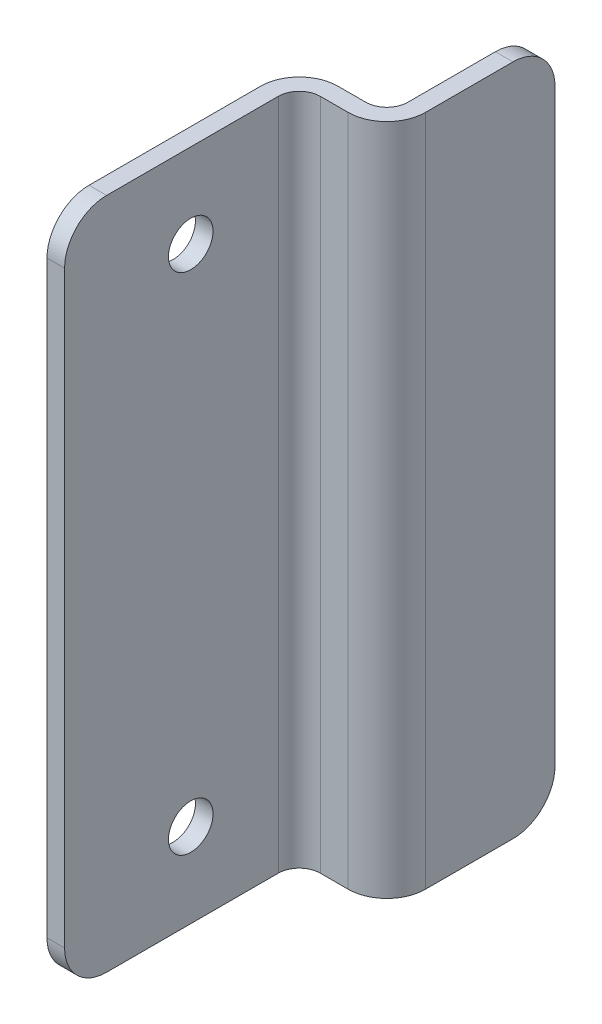
ISO-10303-21;
HEADER;
FILE_DESCRIPTION(('STEP AP214'),'2;1');
FILE_NAME('part.step','',(''),(''),'','','');
FILE_SCHEMA(('AUTOMOTIVE_DESIGN { 1 0 10303 214 1 1 1 1 }'));
ENDSEC;
DATA;
#1=APPLICATION_CONTEXT('core data for automotive mechanical design processes');
#2=APPLICATION_PROTOCOL_DEFINITION('international standard','automotive_design',2000,#1);
#3=PRODUCT_CONTEXT('',#1,'mechanical');
#4=PRODUCT('Part','Part','',(#3));
#5=PRODUCT_RELATED_PRODUCT_CATEGORY('part','',(#4));
#6=PRODUCT_DEFINITION_FORMATION('','',#4);
#7=PRODUCT_DEFINITION_CONTEXT('part definition',#1,'design');
#8=PRODUCT_DEFINITION('design','',#6,#7);
#9=PRODUCT_DEFINITION_SHAPE('','',#8);
#10=(LENGTH_UNIT() NAMED_UNIT(*) SI_UNIT(.MILLI.,.METRE.));
#11=(NAMED_UNIT(*) PLANE_ANGLE_UNIT() SI_UNIT($,.RADIAN.));
#12=(NAMED_UNIT(*) SI_UNIT($,.STERADIAN.) SOLID_ANGLE_UNIT());
#13=UNCERTAINTY_MEASURE_WITH_UNIT(LENGTH_MEASURE(1.E-05),#10,'distance_accuracy_value','');
#14=(GEOMETRIC_REPRESENTATION_CONTEXT(3) GLOBAL_UNCERTAINTY_ASSIGNED_CONTEXT((#13)) GLOBAL_UNIT_ASSIGNED_CONTEXT((#10,
#11,#12)) REPRESENTATION_CONTEXT('',''));
#15=CARTESIAN_POINT('',(0.,0.,0.));
#16=DIRECTION('',(0.,0.,1.));
#17=DIRECTION('',(1.,0.,0.));
#18=AXIS2_PLACEMENT_3D('',#15,#16,#17);
#19=CARTESIAN_POINT('',(22.225,0.,-6.04266));
#20=DIRECTION('',(0.,0.,-1.));
#21=DIRECTION('',(-1.,0.,0.));
#22=AXIS2_PLACEMENT_3D('',#19,#20,#21);
#23=PLANE('',#22);
#24=DIRECTION('',(0.,1.,0.));
#25=VECTOR('',#24,1.);
#26=CARTESIAN_POINT('',(22.225,0.,-6.04266));
#27=LINE('',#26,#25);
#28=CARTESIAN_POINT('',(22.225,6.35,-6.04266));
#29=VERTEX_POINT('',#28);
#30=CARTESIAN_POINT('',(22.225,95.25,-6.04266));
#31=VERTEX_POINT('',#30);
#32=EDGE_CURVE('E228',#29,#31,#27,.T.);
#33=ORIENTED_EDGE('',*,*,#32,.F.);
#34=DIRECTION('',(1.,0.,0.));
#35=VECTOR('',#34,1.);
#36=CARTESIAN_POINT('',(-14.34465,6.35,-6.04266));
#37=LINE('',#36,#35);
#38=CARTESIAN_POINT('',(19.56816,6.35,-6.04266));
#39=VERTEX_POINT('',#38);
#40=EDGE_CURVE('E132',#39,#29,#37,.T.);
#41=ORIENTED_EDGE('',*,*,#40,.F.);
#42=DIRECTION('',(0.,1.,0.));
#43=VECTOR('',#42,1.);
#44=CARTESIAN_POINT('',(19.56816,0.,-6.04266));
#45=LINE('',#44,#43);
#46=CARTESIAN_POINT('',(19.56816,95.25,-6.04266));
#47=VERTEX_POINT('',#46);
#48=EDGE_CURVE('E216',#47,#39,#45,.F.);
#49=ORIENTED_EDGE('',*,*,#48,.F.);
#50=DIRECTION('',(-1.,0.,0.));
#51=VECTOR('',#50,1.);
#52=CARTESIAN_POINT('',(42.91965,95.25,-6.04266));
#53=LINE('',#52,#51);
#54=EDGE_CURVE('E159',#31,#47,#53,.T.);
#55=ORIENTED_EDGE('',*,*,#54,.F.);
#56=EDGE_LOOP('',(#33,#41,#49,#55));
#57=FACE_BOUND('',#56,.T.);
#58=ADVANCED_FACE('F16',(#57),#23,.T.);
#59=CARTESIAN_POINT('',(-14.34465,6.35,0.30734));
#60=DIRECTION('',(1.,0.,0.));
#61=DIRECTION('',(0.,0.,-1.));
#62=AXIS2_PLACEMENT_3D('',#59,#60,#61);
#63=CYLINDRICAL_SURFACE('',#62,6.35);
#64=ORIENTED_EDGE('',*,*,#40,.T.);
#65=CARTESIAN_POINT('',(22.225,6.35,0.30734));
#66=DIRECTION('',(1.,0.,0.));
#67=DIRECTION('',(0.,0.,-1.));
#68=AXIS2_PLACEMENT_3D('',#65,#66,#67);
#69=CIRCLE('',#68,6.35);
#70=CARTESIAN_POINT('',(22.225,0.,0.30734));
#71=VERTEX_POINT('',#70);
#72=EDGE_CURVE('E19',#71,#29,#69,.T.);
#73=ORIENTED_EDGE('',*,*,#72,.F.);
#74=DIRECTION('',(1.,0.,0.));
#75=VECTOR('',#74,1.);
#76=CARTESIAN_POINT('',(0.,0.,0.30734));
#77=LINE('',#76,#75);
#78=CARTESIAN_POINT('',(19.56816,0.,0.30734));
#79=VERTEX_POINT('',#78);
#80=EDGE_CURVE('E130',#71,#79,#77,.F.);
#81=ORIENTED_EDGE('',*,*,#80,.T.);
#82=CARTESIAN_POINT('',(19.56816,6.35,0.30734));
#83=DIRECTION('',(1.,0.,0.));
#84=DIRECTION('',(0.,0.,-1.));
#85=AXIS2_PLACEMENT_3D('',#82,#83,#84);
#86=CIRCLE('',#85,6.35);
#87=EDGE_CURVE('E213',#39,#79,#86,.F.);
#88=ORIENTED_EDGE('',*,*,#87,.F.);
#89=EDGE_LOOP('',(#64,#73,#81,#88));
#90=FACE_BOUND('',#89,.T.);
#91=ADVANCED_FACE('F127',(#90),#63,.T.);
#92=CARTESIAN_POINT('',(9.00684,0.,19.35734));
#93=DIRECTION('',(0.,0.,1.));
#94=DIRECTION('',(1.,0.,0.));
#95=AXIS2_PLACEMENT_3D('',#92,#93,#94);
#96=PLANE('',#95);
#97=DIRECTION('',(1.,0.,0.));
#98=VECTOR('',#97,1.);
#99=CARTESIAN_POINT('',(0.,0.,19.35734));
#100=LINE('',#99,#98);
#101=CARTESIAN_POINT('',(12.18184,0.,19.35734));
#102=VERTEX_POINT('',#101);
#103=CARTESIAN_POINT('',(16.383,0.,19.35734));
#104=VERTEX_POINT('',#103);
#105=EDGE_CURVE('E208',#102,#104,#100,.T.);
#106=ORIENTED_EDGE('',*,*,#105,.T.);
#107=DIRECTION('',(0.,-1.,0.));
#108=VECTOR('',#107,1.);
#109=CARTESIAN_POINT('',(16.383,234.04576,19.35734));
#110=LINE('',#109,#108);
#111=CARTESIAN_POINT('',(16.383,101.6,19.35734));
#112=VERTEX_POINT('',#111);
#113=EDGE_CURVE('E158',#112,#104,#110,.T.);
#114=ORIENTED_EDGE('',*,*,#113,.F.);
#115=DIRECTION('',(1.,0.,0.));
#116=VECTOR('',#115,1.);
#117=CARTESIAN_POINT('',(0.,101.6,19.35734));
#118=LINE('',#117,#116);
#119=CARTESIAN_POINT('',(12.18184,101.6,19.35734));
#120=VERTEX_POINT('',#119);
#121=EDGE_CURVE('E196',#120,#112,#118,.T.);
#122=ORIENTED_EDGE('',*,*,#121,.F.);
#123=DIRECTION('',(0.,1.,0.));
#124=VECTOR('',#123,1.);
#125=CARTESIAN_POINT('',(12.18184,-132.44576,19.35734));
#126=LINE('',#125,#124);
#127=EDGE_CURVE('E155',#120,#102,#126,.F.);
#128=ORIENTED_EDGE('',*,*,#127,.T.);
#129=EDGE_LOOP('',(#106,#114,#122,#128));
#130=FACE_BOUND('',#129,.T.);
#131=ADVANCED_FACE('F463',(#130),#96,.T.);
#132=CARTESIAN_POINT('',(16.383,234.04576,13.51534));
#133=DIRECTION('',(0.,-1.,0.));
#134=DIRECTION('',(0.,0.,-1.));
#135=AXIS2_PLACEMENT_3D('',#132,#133,#134);
#136=CYLINDRICAL_SURFACE('',#135,5.842);
#137=ORIENTED_EDGE('',*,*,#113,.T.);
#138=CARTESIAN_POINT('',(16.383,0.,13.51534));
#139=DIRECTION('',(0.,-1.,0.));
#140=DIRECTION('',(0.,0.,-1.));
#141=AXIS2_PLACEMENT_3D('',#138,#139,#140);
#142=CIRCLE('',#141,5.842);
#143=CARTESIAN_POINT('',(22.225,0.,13.51534));
#144=VERTEX_POINT('',#143);
#145=EDGE_CURVE('E143',#104,#144,#142,.F.);
#146=ORIENTED_EDGE('',*,*,#145,.T.);
#147=DIRECTION('',(0.,1.,0.));
#148=VECTOR('',#147,1.);
#149=CARTESIAN_POINT('',(22.225,0.,13.51534));
#150=LINE('',#149,#148);
#151=CARTESIAN_POINT('',(22.225,101.6,13.51534));
#152=VERTEX_POINT('',#151);
#153=EDGE_CURVE('E135',#152,#144,#150,.F.);
#154=ORIENTED_EDGE('',*,*,#153,.F.);
#155=CARTESIAN_POINT('',(16.383,101.6,13.51534));
#156=DIRECTION('',(0.,-1.,0.));
#157=DIRECTION('',(0.,0.,-1.));
#158=AXIS2_PLACEMENT_3D('',#155,#156,#157);
#159=CIRCLE('',#158,5.842);
#160=EDGE_CURVE('E192',#112,#152,#159,.F.);
#161=ORIENTED_EDGE('',*,*,#160,.F.);
#162=EDGE_LOOP('',(#137,#146,#154,#161));
#163=FACE_BOUND('',#162,.T.);
#164=ADVANCED_FACE('F248',(#163),#136,.T.);
#165=CARTESIAN_POINT('',(22.225,0.,19.35734));
#166=DIRECTION('',(1.,0.,0.));
#167=DIRECTION('',(0.,0.,-1.));
#168=AXIS2_PLACEMENT_3D('',#165,#166,#167);
#169=PLANE('',#168);
#170=DIRECTION('',(0.,0.,1.));
#171=VECTOR('',#170,1.);
#172=CARTESIAN_POINT('',(22.225,0.,0.));
#173=LINE('',#172,#171);
#174=EDGE_CURVE('E138',#144,#71,#173,.F.);
#175=ORIENTED_EDGE('',*,*,#174,.T.);
#176=ORIENTED_EDGE('',*,*,#72,.T.);
#177=ORIENTED_EDGE('',*,*,#32,.T.);
#178=CARTESIAN_POINT('',(22.225,95.25,0.30734));
#179=DIRECTION('',(-1.,0.,0.));
#180=DIRECTION('',(0.,0.,1.));
#181=AXIS2_PLACEMENT_3D('',#178,#179,#180);
#182=CIRCLE('',#181,6.35);
#183=CARTESIAN_POINT('',(22.225,101.6,0.30734));
#184=VERTEX_POINT('',#183);
#185=EDGE_CURVE('E134',#184,#31,#182,.T.);
#186=ORIENTED_EDGE('',*,*,#185,.F.);
#187=DIRECTION('',(0.,0.,1.));
#188=VECTOR('',#187,1.);
#189=CARTESIAN_POINT('',(22.225,101.6,0.));
#190=LINE('',#189,#188);
#191=EDGE_CURVE('E195',#152,#184,#190,.F.);
#192=ORIENTED_EDGE('',*,*,#191,.F.);
#193=ORIENTED_EDGE('',*,*,#153,.T.);
#194=EDGE_LOOP('',(#175,#176,#177,#186,#192,#193));
#195=FACE_BOUND('',#194,.T.);
#196=ADVANCED_FACE('F139',(#195),#169,.T.);
#197=CARTESIAN_POINT('',(42.91965,95.25,0.30734));
#198=DIRECTION('',(-1.,0.,0.));
#199=DIRECTION('',(0.,0.,1.));
#200=AXIS2_PLACEMENT_3D('',#197,#198,#199);
#201=CYLINDRICAL_SURFACE('',#200,6.35);
#202=ORIENTED_EDGE('',*,*,#54,.T.);
#203=CARTESIAN_POINT('',(19.56816,95.25,0.30734));
#204=DIRECTION('',(-1.,0.,0.));
#205=DIRECTION('',(0.,0.,1.));
#206=AXIS2_PLACEMENT_3D('',#203,#204,#205);
#207=CIRCLE('',#206,6.35);
#208=CARTESIAN_POINT('',(19.56816,101.6,0.30734));
#209=VERTEX_POINT('',#208);
#210=EDGE_CURVE('E160',#209,#47,#207,.T.);
#211=ORIENTED_EDGE('',*,*,#210,.F.);
#212=DIRECTION('',(1.,0.,0.));
#213=VECTOR('',#212,1.);
#214=CARTESIAN_POINT('',(0.,101.6,0.30734));
#215=LINE('',#214,#213);
#216=EDGE_CURVE('E225',#184,#209,#215,.F.);
#217=ORIENTED_EDGE('',*,*,#216,.F.);
#218=ORIENTED_EDGE('',*,*,#185,.T.);
#219=EDGE_LOOP('',(#202,#211,#217,#218));
#220=FACE_BOUND('',#219,.T.);
#221=ADVANCED_FACE('F221',(#220),#201,.T.);
#222=CARTESIAN_POINT('',(19.56816,0.,-6.04266));
#223=DIRECTION('',(-1.,0.,0.));
#224=DIRECTION('',(0.,0.,1.));
#225=AXIS2_PLACEMENT_3D('',#222,#223,#224);
#226=PLANE('',#225);
#227=ORIENTED_EDGE('',*,*,#48,.T.);
#228=ORIENTED_EDGE('',*,*,#87,.T.);
#229=DIRECTION('',(0.,0.,1.));
#230=VECTOR('',#229,1.);
#231=CARTESIAN_POINT('',(19.56816,0.,0.));
#232=LINE('',#231,#230);
#233=CARTESIAN_POINT('',(19.56816,0.,13.5255));
#234=VERTEX_POINT('',#233);
#235=EDGE_CURVE('E149',#79,#234,#232,.T.);
#236=ORIENTED_EDGE('',*,*,#235,.T.);
#237=DIRECTION('',(0.,1.,0.));
#238=VECTOR('',#237,1.);
#239=CARTESIAN_POINT('',(19.56816,-132.44576,13.5255));
#240=LINE('',#239,#238);
#241=CARTESIAN_POINT('',(19.56816,101.6,13.5255));
#242=VERTEX_POINT('',#241);
#243=EDGE_CURVE('E215',#234,#242,#240,.T.);
#244=ORIENTED_EDGE('',*,*,#243,.T.);
#245=DIRECTION('',(0.,0.,1.));
#246=VECTOR('',#245,1.);
#247=CARTESIAN_POINT('',(19.56816,101.6,0.));
#248=LINE('',#247,#246);
#249=EDGE_CURVE('E191',#209,#242,#248,.T.);
#250=ORIENTED_EDGE('',*,*,#249,.F.);
#251=ORIENTED_EDGE('',*,*,#210,.T.);
#252=EDGE_LOOP('',(#227,#228,#236,#244,#250,#251));
#253=FACE_BOUND('',#252,.T.);
#254=ADVANCED_FACE('F235',(#253),#226,.T.);
#255=CARTESIAN_POINT('',(16.39316,-132.44576,13.5255));
#256=DIRECTION('',(0.,1.,0.));
#257=DIRECTION('',(0.,0.,1.));
#258=AXIS2_PLACEMENT_3D('',#255,#256,#257);
#259=CYLINDRICAL_SURFACE('',#258,3.175);
#260=ORIENTED_EDGE('',*,*,#243,.F.);
#261=CARTESIAN_POINT('',(16.39316,0.,13.5255));
#262=DIRECTION('',(0.,1.,0.));
#263=DIRECTION('',(0.,0.,1.));
#264=AXIS2_PLACEMENT_3D('',#261,#262,#263);
#265=CIRCLE('',#264,3.175);
#266=CARTESIAN_POINT('',(16.39316,0.,16.7005));
#267=VERTEX_POINT('',#266);
#268=EDGE_CURVE('E151',#234,#267,#265,.F.);
#269=ORIENTED_EDGE('',*,*,#268,.T.);
#270=DIRECTION('',(0.,1.,0.));
#271=VECTOR('',#270,1.);
#272=CARTESIAN_POINT('',(16.39316,0.,16.7005));
#273=LINE('',#272,#271);
#274=CARTESIAN_POINT('',(16.39316,101.6,16.7005));
#275=VERTEX_POINT('',#274);
#276=EDGE_CURVE('E294',#275,#267,#273,.F.);
#277=ORIENTED_EDGE('',*,*,#276,.F.);
#278=CARTESIAN_POINT('',(16.39316,101.6,13.5255));
#279=DIRECTION('',(0.,1.,0.));
#280=DIRECTION('',(0.,0.,1.));
#281=AXIS2_PLACEMENT_3D('',#278,#279,#280);
#282=CIRCLE('',#281,3.175);
#283=EDGE_CURVE('E188',#242,#275,#282,.F.);
#284=ORIENTED_EDGE('',*,*,#283,.F.);
#285=EDGE_LOOP('',(#260,#269,#277,#284));
#286=FACE_BOUND('',#285,.T.);
#287=ADVANCED_FACE('F310',(#286),#259,.F.);
#288=CARTESIAN_POINT('',(19.56816,0.,16.7005));
#289=DIRECTION('',(0.,0.,-1.));
#290=DIRECTION('',(-1.,0.,0.));
#291=AXIS2_PLACEMENT_3D('',#288,#289,#290);
#292=PLANE('',#291);
#293=DIRECTION('',(1.,0.,0.));
#294=VECTOR('',#293,1.);
#295=CARTESIAN_POINT('',(0.,0.,16.7005));
#296=LINE('',#295,#294);
#297=CARTESIAN_POINT('',(12.192,0.,16.7005));
#298=VERTEX_POINT('',#297);
#299=EDGE_CURVE('E205',#267,#298,#296,.F.);
#300=ORIENTED_EDGE('',*,*,#299,.T.);
#301=DIRECTION('',(0.,-1.,0.));
#302=VECTOR('',#301,1.);
#303=CARTESIAN_POINT('',(12.192,234.04576,16.7005));
#304=LINE('',#303,#302);
#305=CARTESIAN_POINT('',(12.192,101.6,16.7005));
#306=VERTEX_POINT('',#305);
#307=EDGE_CURVE('E291',#306,#298,#304,.T.);
#308=ORIENTED_EDGE('',*,*,#307,.F.);
#309=DIRECTION('',(1.,0.,0.));
#310=VECTOR('',#309,1.);
#311=CARTESIAN_POINT('',(0.,101.6,16.7005));
#312=LINE('',#311,#310);
#313=EDGE_CURVE('E187',#275,#306,#312,.F.);
#314=ORIENTED_EDGE('',*,*,#313,.F.);
#315=ORIENTED_EDGE('',*,*,#276,.T.);
#316=EDGE_LOOP('',(#300,#308,#314,#315));
#317=FACE_BOUND('',#316,.T.);
#318=ADVANCED_FACE('F299',(#317),#292,.T.);
#319=CARTESIAN_POINT('',(12.192,234.04576,22.5425));
#320=DIRECTION('',(0.,-1.,0.));
#321=DIRECTION('',(0.,0.,-1.));
#322=AXIS2_PLACEMENT_3D('',#319,#320,#321);
#323=CYLINDRICAL_SURFACE('',#322,5.842);
#324=ORIENTED_EDGE('',*,*,#307,.T.);
#325=CARTESIAN_POINT('',(12.192,0.,22.5425));
#326=DIRECTION('',(0.,-1.,0.));
#327=DIRECTION('',(0.,0.,-1.));
#328=AXIS2_PLACEMENT_3D('',#325,#326,#327);
#329=CIRCLE('',#328,5.842);
#330=CARTESIAN_POINT('',(6.35,0.,22.5425));
#331=VERTEX_POINT('',#330);
#332=EDGE_CURVE('E202',#298,#331,#329,.F.);
#333=ORIENTED_EDGE('',*,*,#332,.T.);
#334=DIRECTION('',(0.,1.,0.));
#335=VECTOR('',#334,1.);
#336=CARTESIAN_POINT('',(6.35,0.,22.5425));
#337=LINE('',#336,#335);
#338=CARTESIAN_POINT('',(6.35,101.6,22.5425));
#339=VERTEX_POINT('',#338);
#340=EDGE_CURVE('E288',#339,#331,#337,.F.);
#341=ORIENTED_EDGE('',*,*,#340,.F.);
#342=CARTESIAN_POINT('',(12.192,101.6,22.5425));
#343=DIRECTION('',(0.,-1.,0.));
#344=DIRECTION('',(0.,0.,-1.));
#345=AXIS2_PLACEMENT_3D('',#342,#343,#344);
#346=CIRCLE('',#345,5.842);
#347=EDGE_CURVE('E183',#306,#339,#346,.F.);
#348=ORIENTED_EDGE('',*,*,#347,.F.);
#349=EDGE_LOOP('',(#324,#333,#341,#348));
#350=FACE_BOUND('',#349,.T.);
#351=ADVANCED_FACE('F303',(#350),#323,.T.);
#352=CARTESIAN_POINT('',(6.35,0.,16.7005));
#353=DIRECTION('',(-1.,0.,0.));
#354=DIRECTION('',(0.,0.,1.));
#355=AXIS2_PLACEMENT_3D('',#352,#353,#354);
#356=PLANE('',#355);
#357=CARTESIAN_POINT('',(6.35,88.9,35.7505));
#358=DIRECTION('',(1.,0.,0.));
#359=DIRECTION('',(0.,0.,-1.));
#360=AXIS2_PLACEMENT_3D('',#357,#358,#359);
#361=CIRCLE('',#360,3.3655);
#362=CARTESIAN_POINT('',(6.35,88.9,32.385));
#363=VERTEX_POINT('',#362);
#364=EDGE_CURVE('E173',#363,#363,#361,.T.);
#365=ORIENTED_EDGE('',*,*,#364,.T.);
#366=EDGE_LOOP('',(#365));
#367=FACE_BOUND('',#366,.T.);
#368=CARTESIAN_POINT('',(6.35,12.7,35.7505));
#369=DIRECTION('',(1.,0.,0.));
#370=DIRECTION('',(0.,0.,-1.));
#371=AXIS2_PLACEMENT_3D('',#368,#369,#370);
#372=CIRCLE('',#371,3.3655);
#373=CARTESIAN_POINT('',(6.35,12.7,32.385));
#374=VERTEX_POINT('',#373);
#375=EDGE_CURVE('E176',#374,#374,#372,.T.);
#376=ORIENTED_EDGE('',*,*,#375,.T.);
#377=EDGE_LOOP('',(#376));
#378=FACE_BOUND('',#377,.T.);
#379=DIRECTION('',(0.,1.,0.));
#380=VECTOR('',#379,1.);
#381=CARTESIAN_POINT('',(6.35,0.,54.8005));
#382=LINE('',#381,#380);
#383=CARTESIAN_POINT('',(6.35,95.25,54.8005));
#384=VERTEX_POINT('',#383);
#385=CARTESIAN_POINT('',(6.35,6.35,54.8005));
#386=VERTEX_POINT('',#385);
#387=EDGE_CURVE('E286',#384,#386,#382,.F.);
#388=ORIENTED_EDGE('',*,*,#387,.F.);
#389=CARTESIAN_POINT('',(6.35,95.25,48.4505));
#390=DIRECTION('',(1.,0.,0.));
#391=DIRECTION('',(0.,0.,-1.));
#392=AXIS2_PLACEMENT_3D('',#389,#390,#391);
#393=CIRCLE('',#392,6.35);
#394=CARTESIAN_POINT('',(6.35,101.6,48.4505));
#395=VERTEX_POINT('',#394);
#396=EDGE_CURVE('E180',#395,#384,#393,.T.);
#397=ORIENTED_EDGE('',*,*,#396,.F.);
#398=DIRECTION('',(0.,0.,1.));
#399=VECTOR('',#398,1.);
#400=CARTESIAN_POINT('',(6.35,101.6,0.));
#401=LINE('',#400,#399);
#402=EDGE_CURVE('E186',#339,#395,#401,.T.);
#403=ORIENTED_EDGE('',*,*,#402,.F.);
#404=ORIENTED_EDGE('',*,*,#340,.T.);
#405=DIRECTION('',(0.,0.,1.));
#406=VECTOR('',#405,1.);
#407=CARTESIAN_POINT('',(6.35,0.,0.));
#408=LINE('',#407,#406);
#409=CARTESIAN_POINT('',(6.35,0.,48.4505));
#410=VERTEX_POINT('',#409);
#411=EDGE_CURVE('E204',#331,#410,#408,.T.);
#412=ORIENTED_EDGE('',*,*,#411,.T.);
#413=CARTESIAN_POINT('',(6.35,6.35,48.4505));
#414=DIRECTION('',(-1.,0.,0.));
#415=DIRECTION('',(0.,0.,1.));
#416=AXIS2_PLACEMENT_3D('',#413,#414,#415);
#417=CIRCLE('',#416,6.35);
#418=EDGE_CURVE('E209',#386,#410,#417,.F.);
#419=ORIENTED_EDGE('',*,*,#418,.F.);
#420=EDGE_LOOP('',(#388,#397,#403,#404,#412,#419));
#421=FACE_BOUND('',#420,.T.);
#422=ADVANCED_FACE('F307',(#367,#378,#421),#356,.T.);
#423=CARTESIAN_POINT('',(6.35,0.,54.8005));
#424=DIRECTION('',(0.,0.,1.));
#425=DIRECTION('',(1.,0.,0.));
#426=AXIS2_PLACEMENT_3D('',#423,#424,#425);
#427=PLANE('',#426);
#428=DIRECTION('',(0.,1.,0.));
#429=VECTOR('',#428,1.);
#430=CARTESIAN_POINT('',(9.00684,0.,54.8005));
#431=LINE('',#430,#429);
#432=CARTESIAN_POINT('',(9.00684,95.25,54.8005));
#433=VERTEX_POINT('',#432);
#434=CARTESIAN_POINT('',(9.00684,6.35,54.8005));
#435=VERTEX_POINT('',#434);
#436=EDGE_CURVE('E172',#433,#435,#431,.F.);
#437=ORIENTED_EDGE('',*,*,#436,.F.);
#438=DIRECTION('',(1.,0.,0.));
#439=VECTOR('',#438,1.);
#440=CARTESIAN_POINT('',(-14.34465,95.25,54.8005));
#441=LINE('',#440,#439);
#442=EDGE_CURVE('E179',#384,#433,#441,.T.);
#443=ORIENTED_EDGE('',*,*,#442,.F.);
#444=ORIENTED_EDGE('',*,*,#387,.T.);
#445=DIRECTION('',(-1.,0.,0.));
#446=VECTOR('',#445,1.);
#447=CARTESIAN_POINT('',(42.91965,6.35,54.8005));
#448=LINE('',#447,#446);
#449=EDGE_CURVE('E212',#435,#386,#448,.T.);
#450=ORIENTED_EDGE('',*,*,#449,.F.);
#451=EDGE_LOOP('',(#437,#443,#444,#450));
#452=FACE_BOUND('',#451,.T.);
#453=ADVANCED_FACE('F348',(#452),#427,.T.);
#454=CARTESIAN_POINT('',(42.91965,6.35,48.4505));
#455=DIRECTION('',(-1.,0.,0.));
#456=DIRECTION('',(0.,0.,1.));
#457=AXIS2_PLACEMENT_3D('',#454,#455,#456);
#458=CYLINDRICAL_SURFACE('',#457,6.35);
#459=ORIENTED_EDGE('',*,*,#449,.T.);
#460=ORIENTED_EDGE('',*,*,#418,.T.);
#461=DIRECTION('',(1.,0.,0.));
#462=VECTOR('',#461,1.);
#463=CARTESIAN_POINT('',(0.,0.,48.4505));
#464=LINE('',#463,#462);
#465=CARTESIAN_POINT('',(9.00684,0.,48.4505));
#466=VERTEX_POINT('',#465);
#467=EDGE_CURVE('E211',#410,#466,#464,.T.);
#468=ORIENTED_EDGE('',*,*,#467,.T.);
#469=CARTESIAN_POINT('',(9.00684,6.35,48.4505));
#470=DIRECTION('',(-1.,0.,0.));
#471=DIRECTION('',(0.,0.,1.));
#472=AXIS2_PLACEMENT_3D('',#469,#470,#471);
#473=CIRCLE('',#472,6.35);
#474=EDGE_CURVE('E168',#435,#466,#473,.F.);
#475=ORIENTED_EDGE('',*,*,#474,.F.);
#476=EDGE_LOOP('',(#459,#460,#468,#475));
#477=FACE_BOUND('',#476,.T.);
#478=ADVANCED_FACE('F345',(#477),#458,.T.);
#479=CARTESIAN_POINT('',(0.,0.,0.));
#480=DIRECTION('',(0.,1.,0.));
#481=DIRECTION('',(0.,0.,1.));
#482=AXIS2_PLACEMENT_3D('',#479,#480,#481);
#483=PLANE('',#482);
#484=ORIENTED_EDGE('',*,*,#332,.F.);
#485=ORIENTED_EDGE('',*,*,#299,.F.);
#486=ORIENTED_EDGE('',*,*,#268,.F.);
#487=ORIENTED_EDGE('',*,*,#235,.F.);
#488=ORIENTED_EDGE('',*,*,#80,.F.);
#489=ORIENTED_EDGE('',*,*,#174,.F.);
#490=ORIENTED_EDGE('',*,*,#145,.F.);
#491=ORIENTED_EDGE('',*,*,#105,.F.);
#492=CARTESIAN_POINT('',(12.18184,0.,22.53234));
#493=DIRECTION('',(0.,1.,0.));
#494=DIRECTION('',(0.,0.,1.));
#495=AXIS2_PLACEMENT_3D('',#492,#493,#494);
#496=CIRCLE('',#495,3.175);
#497=CARTESIAN_POINT('',(9.00684,0.,22.53234));
#498=VERTEX_POINT('',#497);
#499=EDGE_CURVE('E200',#102,#498,#496,.T.);
#500=ORIENTED_EDGE('',*,*,#499,.T.);
#501=DIRECTION('',(0.,0.,-1.));
#502=VECTOR('',#501,1.);
#503=CARTESIAN_POINT('',(9.00684,0.,54.8005));
#504=LINE('',#503,#502);
#505=EDGE_CURVE('E171',#466,#498,#504,.T.);
#506=ORIENTED_EDGE('',*,*,#505,.F.);
#507=ORIENTED_EDGE('',*,*,#467,.F.);
#508=ORIENTED_EDGE('',*,*,#411,.F.);
#509=EDGE_LOOP('',(#484,#485,#486,#487,#488,#489,#490,#491,#500,#506,#507,#508));
#510=FACE_BOUND('',#509,.T.);
#511=ADVANCED_FACE('F147',(#510),#483,.F.);
#512=CARTESIAN_POINT('',(12.18184,-132.44576,22.53234));
#513=DIRECTION('',(0.,1.,0.));
#514=DIRECTION('',(0.,0.,1.));
#515=AXIS2_PLACEMENT_3D('',#512,#513,#514);
#516=CYLINDRICAL_SURFACE('',#515,3.175);
#517=DIRECTION('',(0.,1.,0.));
#518=VECTOR('',#517,1.);
#519=CARTESIAN_POINT('',(9.00684,0.,22.53234));
#520=LINE('',#519,#518);
#521=CARTESIAN_POINT('',(9.00684,101.6,22.53234));
#522=VERTEX_POINT('',#521);
#523=EDGE_CURVE('E260',#498,#522,#520,.T.);
#524=ORIENTED_EDGE('',*,*,#523,.F.);
#525=ORIENTED_EDGE('',*,*,#499,.F.);
#526=ORIENTED_EDGE('',*,*,#127,.F.);
#527=CARTESIAN_POINT('',(12.18184,101.6,22.53234));
#528=DIRECTION('',(0.,1.,0.));
#529=DIRECTION('',(0.,0.,1.));
#530=AXIS2_PLACEMENT_3D('',#527,#528,#529);
#531=CIRCLE('',#530,3.175);
#532=EDGE_CURVE('E197',#522,#120,#531,.F.);
#533=ORIENTED_EDGE('',*,*,#532,.F.);
#534=EDGE_LOOP('',(#524,#525,#526,#533));
#535=FACE_BOUND('',#534,.T.);
#536=ADVANCED_FACE('F258',(#535),#516,.F.);
#537=CARTESIAN_POINT('',(0.,101.6,0.));
#538=DIRECTION('',(0.,1.,0.));
#539=DIRECTION('',(0.,0.,1.));
#540=AXIS2_PLACEMENT_3D('',#537,#538,#539);
#541=PLANE('',#540);
#542=ORIENTED_EDGE('',*,*,#402,.T.);
#543=DIRECTION('',(1.,0.,0.));
#544=VECTOR('',#543,1.);
#545=CARTESIAN_POINT('',(-14.34465,101.6,48.4505));
#546=LINE('',#545,#544);
#547=CARTESIAN_POINT('',(9.00684,101.6,48.4505));
#548=VERTEX_POINT('',#547);
#549=EDGE_CURVE('E34',#548,#395,#546,.F.);
#550=ORIENTED_EDGE('',*,*,#549,.F.);
#551=DIRECTION('',(0.,0.,-1.));
#552=VECTOR('',#551,1.);
#553=CARTESIAN_POINT('',(9.00684,101.6,54.8005));
#554=LINE('',#553,#552);
#555=EDGE_CURVE('E167',#522,#548,#554,.F.);
#556=ORIENTED_EDGE('',*,*,#555,.F.);
#557=ORIENTED_EDGE('',*,*,#532,.T.);
#558=ORIENTED_EDGE('',*,*,#121,.T.);
#559=ORIENTED_EDGE('',*,*,#160,.T.);
#560=ORIENTED_EDGE('',*,*,#191,.T.);
#561=ORIENTED_EDGE('',*,*,#216,.T.);
#562=ORIENTED_EDGE('',*,*,#249,.T.);
#563=ORIENTED_EDGE('',*,*,#283,.T.);
#564=ORIENTED_EDGE('',*,*,#313,.T.);
#565=ORIENTED_EDGE('',*,*,#347,.T.);
#566=EDGE_LOOP('',(#542,#550,#556,#557,#558,#559,#560,#561,#562,#563,#564,#565));
#567=FACE_BOUND('',#566,.T.);
#568=ADVANCED_FACE('F240',(#567),#541,.T.);
#569=CARTESIAN_POINT('',(-14.34465,95.25,48.4505));
#570=DIRECTION('',(1.,0.,0.));
#571=DIRECTION('',(0.,0.,-1.));
#572=AXIS2_PLACEMENT_3D('',#569,#570,#571);
#573=CYLINDRICAL_SURFACE('',#572,6.35);
#574=ORIENTED_EDGE('',*,*,#442,.T.);
#575=CARTESIAN_POINT('',(9.00684,95.25,48.4505));
#576=DIRECTION('',(1.,0.,0.));
#577=DIRECTION('',(0.,0.,-1.));
#578=AXIS2_PLACEMENT_3D('',#575,#576,#577);
#579=CIRCLE('',#578,6.35);
#580=EDGE_CURVE('E164',#548,#433,#579,.T.);
#581=ORIENTED_EDGE('',*,*,#580,.F.);
#582=ORIENTED_EDGE('',*,*,#549,.T.);
#583=ORIENTED_EDGE('',*,*,#396,.T.);
#584=EDGE_LOOP('',(#574,#581,#582,#583));
#585=FACE_BOUND('',#584,.T.);
#586=ADVANCED_FACE('F334',(#585),#573,.T.);
#587=CARTESIAN_POINT('',(9.00684,12.7,35.7505));
#588=DIRECTION('',(1.,0.,0.));
#589=DIRECTION('',(0.,0.,-1.));
#590=AXIS2_PLACEMENT_3D('',#587,#588,#589);
#591=CYLINDRICAL_SURFACE('',#590,3.3655);
#592=ORIENTED_EDGE('',*,*,#375,.F.);
#593=EDGE_LOOP('',(#592));
#594=FACE_BOUND('',#593,.T.);
#595=CARTESIAN_POINT('',(9.00684,12.7,35.7505));
#596=DIRECTION('',(1.,0.,0.));
#597=DIRECTION('',(0.,0.,-1.));
#598=AXIS2_PLACEMENT_3D('',#595,#596,#597);
#599=CIRCLE('',#598,3.3655);
#600=CARTESIAN_POINT('',(9.00684,12.7,32.385));
#601=VERTEX_POINT('',#600);
#602=EDGE_CURVE('E25',#601,#601,#599,.F.);
#603=ORIENTED_EDGE('',*,*,#602,.F.);
#604=EDGE_LOOP('',(#603));
#605=FACE_BOUND('',#604,.T.);
#606=ADVANCED_FACE('F327',(#594,#605),#591,.F.);
#607=CARTESIAN_POINT('',(9.00684,88.9,35.7505));
#608=DIRECTION('',(1.,0.,0.));
#609=DIRECTION('',(0.,0.,-1.));
#610=AXIS2_PLACEMENT_3D('',#607,#608,#609);
#611=CYLINDRICAL_SURFACE('',#610,3.3655);
#612=ORIENTED_EDGE('',*,*,#364,.F.);
#613=EDGE_LOOP('',(#612));
#614=FACE_BOUND('',#613,.T.);
#615=CARTESIAN_POINT('',(9.00684,88.9,35.7505));
#616=DIRECTION('',(1.,0.,0.));
#617=DIRECTION('',(0.,0.,-1.));
#618=AXIS2_PLACEMENT_3D('',#615,#616,#617);
#619=CIRCLE('',#618,3.3655);
#620=CARTESIAN_POINT('',(9.00684,88.9,32.385));
#621=VERTEX_POINT('',#620);
#622=EDGE_CURVE('E11',#621,#621,#619,.F.);
#623=ORIENTED_EDGE('',*,*,#622,.F.);
#624=EDGE_LOOP('',(#623));
#625=FACE_BOUND('',#624,.T.);
#626=ADVANCED_FACE('F321',(#614,#625),#611,.F.);
#627=CARTESIAN_POINT('',(9.00684,0.,54.8005));
#628=DIRECTION('',(1.,0.,0.));
#629=DIRECTION('',(0.,0.,-1.));
#630=AXIS2_PLACEMENT_3D('',#627,#628,#629);
#631=PLANE('',#630);
#632=ORIENTED_EDGE('',*,*,#622,.T.);
#633=EDGE_LOOP('',(#632));
#634=FACE_BOUND('',#633,.T.);
#635=ORIENTED_EDGE('',*,*,#602,.T.);
#636=EDGE_LOOP('',(#635));
#637=FACE_BOUND('',#636,.T.);
#638=ORIENTED_EDGE('',*,*,#555,.T.);
#639=ORIENTED_EDGE('',*,*,#580,.T.);
#640=ORIENTED_EDGE('',*,*,#436,.T.);
#641=ORIENTED_EDGE('',*,*,#474,.T.);
#642=ORIENTED_EDGE('',*,*,#505,.T.);
#643=ORIENTED_EDGE('',*,*,#523,.T.);
#644=EDGE_LOOP('',(#638,#639,#640,#641,#642,#643));
#645=FACE_BOUND('',#644,.T.);
#646=ADVANCED_FACE('F265',(#634,#637,#645),#631,.T.);
#647=CLOSED_SHELL('',(#58,#91,#131,#164,#196,#221,#254,#287,#318,#351,#422,#453,#478,#511,#536,
#568,#586,#606,#626,#646));
#648=MANIFOLD_SOLID_BREP('B1',#647);
#649=ADVANCED_BREP_SHAPE_REPRESENTATION('',(#18,#648),#14);
#650=SHAPE_DEFINITION_REPRESENTATION(#9,#649);
ENDSEC;
END-ISO-10303-21;
